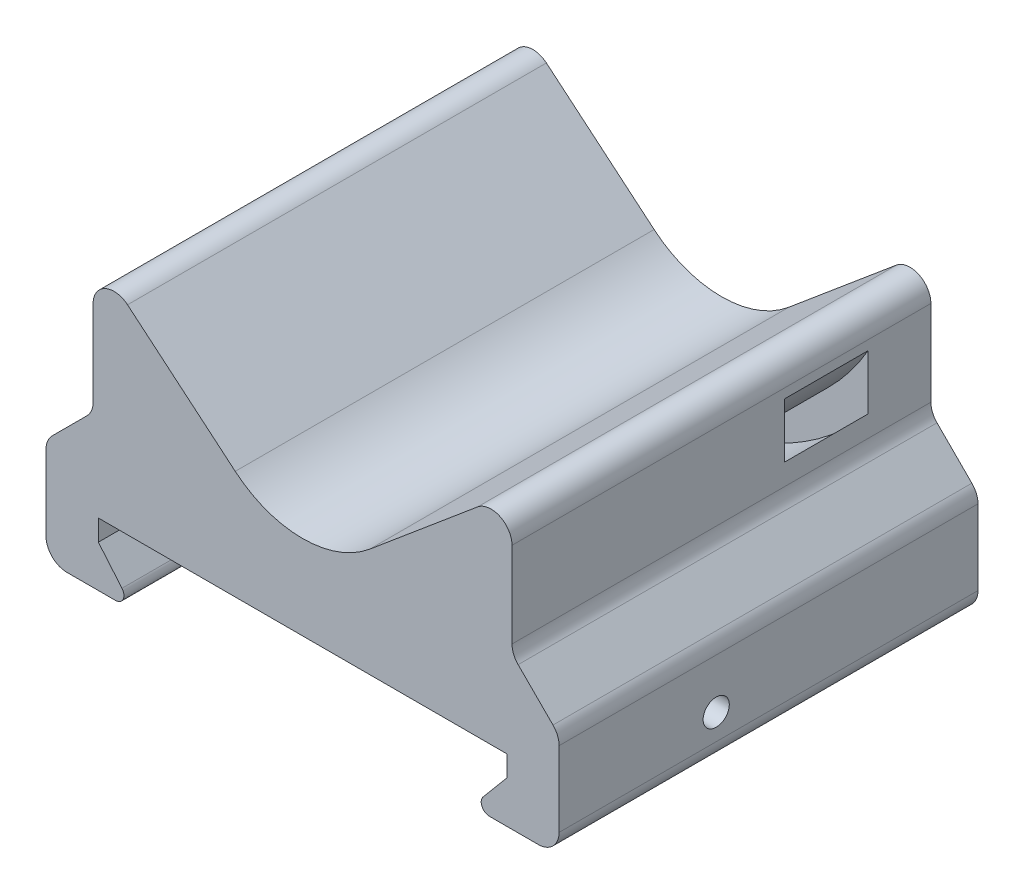
ISO-10303-21;
HEADER;
FILE_DESCRIPTION(('STEP AP214'),'2;1');
FILE_NAME('part.step','',(''),(''),'','','');
FILE_SCHEMA(('AUTOMOTIVE_DESIGN { 1 0 10303 214 1 1 1 1 }'));
ENDSEC;
DATA;
#1=APPLICATION_CONTEXT('core data for automotive mechanical design processes');
#2=APPLICATION_PROTOCOL_DEFINITION('international standard','automotive_design',2000,#1);
#3=PRODUCT_CONTEXT('',#1,'mechanical');
#4=PRODUCT('Part','Part','',(#3));
#5=PRODUCT_RELATED_PRODUCT_CATEGORY('part','',(#4));
#6=PRODUCT_DEFINITION_FORMATION('','',#4);
#7=PRODUCT_DEFINITION_CONTEXT('part definition',#1,'design');
#8=PRODUCT_DEFINITION('design','',#6,#7);
#9=PRODUCT_DEFINITION_SHAPE('','',#8);
#10=(LENGTH_UNIT() NAMED_UNIT(*) SI_UNIT(.MILLI.,.METRE.));
#11=(NAMED_UNIT(*) PLANE_ANGLE_UNIT() SI_UNIT($,.RADIAN.));
#12=(NAMED_UNIT(*) SI_UNIT($,.STERADIAN.) SOLID_ANGLE_UNIT());
#13=UNCERTAINTY_MEASURE_WITH_UNIT(LENGTH_MEASURE(1.E-05),#10,'distance_accuracy_value','');
#14=(GEOMETRIC_REPRESENTATION_CONTEXT(3) GLOBAL_UNCERTAINTY_ASSIGNED_CONTEXT((#13)) GLOBAL_UNIT_ASSIGNED_CONTEXT((#10,
#11,#12)) REPRESENTATION_CONTEXT('',''));
#15=CARTESIAN_POINT('',(0.,0.,0.));
#16=DIRECTION('',(0.,0.,1.));
#17=DIRECTION('',(1.,0.,0.));
#18=AXIS2_PLACEMENT_3D('',#15,#16,#17);
#19=CARTESIAN_POINT('',(19.5,-2.,40.));
#20=DIRECTION('',(1.,0.,0.));
#21=DIRECTION('',(0.,0.,-1.));
#22=AXIS2_PLACEMENT_3D('',#19,#20,#21);
#23=PLANE('',#22);
#24=DIRECTION('',(0.,0.,-1.));
#25=VECTOR('',#24,1.);
#26=CARTESIAN_POINT('',(19.5,-2.,40.));
#27=LINE('',#26,#25);
#28=CARTESIAN_POINT('',(19.5,-2.,23.8316867639954));
#29=VERTEX_POINT('',#28);
#30=CARTESIAN_POINT('',(19.5,-2.,0.));
#31=VERTEX_POINT('',#30);
#32=EDGE_CURVE('E330',#29,#31,#27,.T.);
#33=ORIENTED_EDGE('',*,*,#32,.F.);
#34=CARTESIAN_POINT('',(19.5,-1.55554057263177,25.));
#35=DIRECTION('',(1.,0.,0.));
#36=DIRECTION('',(0.,0.,-1.));
#37=AXIS2_PLACEMENT_3D('',#34,#35,#36);
#38=CIRCLE('',#37,1.24999999999999);
#39=CARTESIAN_POINT('',(19.5,-2.,26.1683132360046));
#40=VERTEX_POINT('',#39);
#41=EDGE_CURVE('E50',#29,#40,#38,.T.);
#42=ORIENTED_EDGE('',*,*,#41,.T.);
#43=CARTESIAN_POINT('',(19.5,-2.,40.));
#44=VERTEX_POINT('',#43);
#45=EDGE_CURVE('E331',#44,#40,#27,.T.);
#46=ORIENTED_EDGE('',*,*,#45,.F.);
#47=DIRECTION('',(0.,-1.,0.));
#48=VECTOR('',#47,1.);
#49=CARTESIAN_POINT('',(19.5,-2.,40.));
#50=LINE('',#49,#48);
#51=CARTESIAN_POINT('',(19.5,0.,40.));
#52=VERTEX_POINT('',#51);
#53=EDGE_CURVE('E377',#52,#44,#50,.T.);
#54=ORIENTED_EDGE('',*,*,#53,.F.);
#55=DIRECTION('',(0.,0.,-1.));
#56=VECTOR('',#55,1.);
#57=CARTESIAN_POINT('',(19.5,0.,40.));
#58=LINE('',#57,#56);
#59=CARTESIAN_POINT('',(19.5,0.,0.));
#60=VERTEX_POINT('',#59);
#61=EDGE_CURVE('E430',#52,#60,#58,.T.);
#62=ORIENTED_EDGE('',*,*,#61,.T.);
#63=DIRECTION('',(0.,-1.,0.));
#64=VECTOR('',#63,1.);
#65=CARTESIAN_POINT('',(19.5,-2.,0.));
#66=LINE('',#65,#64);
#67=EDGE_CURVE('E376',#60,#31,#66,.T.);
#68=ORIENTED_EDGE('',*,*,#67,.T.);
#69=EDGE_LOOP('',(#33,#42,#46,#54,#62,#68));
#70=FACE_BOUND('',#69,.T.);
#71=ADVANCED_FACE('F37',(#70),#23,.F.);
#72=CARTESIAN_POINT('',(17.2463714572033,-4.68576991225075,40.));
#73=DIRECTION('',(0.766044443118974,-0.642787609686544,0.));
#74=DIRECTION('',(0.642787609686544,0.766044443118974,0.));
#75=AXIS2_PLACEMENT_3D('',#72,#73,#74);
#76=PLANE('',#75);
#77=ORIENTED_EDGE('',*,*,#45,.T.);
#78=CARTESIAN_POINT('',(19.872945741578,-1.55554057263177,25.));
#79=DIRECTION('',(0.766044443118974,-0.642787609686544,0.));
#80=DIRECTION('',(-0.642787609686544,-0.766044443118974,0.));
#81=AXIS2_PLACEMENT_3D('',#78,#79,#80);
#82=ELLIPSE('',#81,1.63175911166534,1.24999999999999);
#83=EDGE_CURVE('E253',#40,#29,#82,.T.);
#84=ORIENTED_EDGE('',*,*,#83,.T.);
#85=ORIENTED_EDGE('',*,*,#32,.T.);
#86=DIRECTION('',(-0.642787609686544,-0.766044443118974,0.));
#87=VECTOR('',#86,1.);
#88=CARTESIAN_POINT('',(17.2463714572033,-4.68576991225075,0.));
#89=LINE('',#88,#87);
#90=CARTESIAN_POINT('',(17.2463714572033,-4.68576991225075,0.));
#91=VERTEX_POINT('',#90);
#92=EDGE_CURVE('E433',#31,#91,#89,.T.);
#93=ORIENTED_EDGE('',*,*,#92,.T.);
#94=DIRECTION('',(0.,0.,-1.));
#95=VECTOR('',#94,1.);
#96=CARTESIAN_POINT('',(17.2463714572033,-4.68576991225075,40.));
#97=LINE('',#96,#95);
#98=CARTESIAN_POINT('',(17.2463714572033,-4.68576991225075,40.));
#99=VERTEX_POINT('',#98);
#100=EDGE_CURVE('E327',#99,#91,#97,.T.);
#101=ORIENTED_EDGE('',*,*,#100,.F.);
#102=DIRECTION('',(-0.642787609686544,-0.766044443118974,0.));
#103=VECTOR('',#102,1.);
#104=CARTESIAN_POINT('',(17.2463714572033,-4.68576991225075,40.));
#105=LINE('',#104,#103);
#106=EDGE_CURVE('E380',#44,#99,#105,.T.);
#107=ORIENTED_EDGE('',*,*,#106,.F.);
#108=EDGE_LOOP('',(#77,#84,#85,#93,#101,#107));
#109=FACE_BOUND('',#108,.T.);
#110=ADVANCED_FACE('F500',(#109),#76,.F.);
#111=CARTESIAN_POINT('',(17.8592070116985,-5.2,40.));
#112=DIRECTION('',(0.,0.,-1.));
#113=DIRECTION('',(-1.,0.,0.));
#114=AXIS2_PLACEMENT_3D('',#111,#112,#113);
#115=CYLINDRICAL_SURFACE('',#114,0.800000000000001);
#116=CARTESIAN_POINT('',(17.8592070116985,-5.2,0.));
#117=DIRECTION('',(0.,0.,1.));
#118=DIRECTION('',(-1.,0.,0.));
#119=AXIS2_PLACEMENT_3D('',#116,#117,#118);
#120=CIRCLE('',#119,0.800000000000001);
#121=CARTESIAN_POINT('',(17.8592070116985,-6.,0.));
#122=VERTEX_POINT('',#121);
#123=EDGE_CURVE('E435',#91,#122,#120,.T.);
#124=ORIENTED_EDGE('',*,*,#123,.T.);
#125=DIRECTION('',(0.,0.,-1.));
#126=VECTOR('',#125,1.);
#127=CARTESIAN_POINT('',(17.8592070116985,-6.,40.));
#128=LINE('',#127,#126);
#129=CARTESIAN_POINT('',(17.8592070116985,-6.,40.));
#130=VERTEX_POINT('',#129);
#131=EDGE_CURVE('E324',#130,#122,#128,.T.);
#132=ORIENTED_EDGE('',*,*,#131,.F.);
#133=CARTESIAN_POINT('',(17.8592070116985,-5.2,40.));
#134=DIRECTION('',(0.,0.,1.));
#135=DIRECTION('',(-1.,0.,0.));
#136=AXIS2_PLACEMENT_3D('',#133,#134,#135);
#137=CIRCLE('',#136,0.800000000000001);
#138=EDGE_CURVE('E383',#99,#130,#137,.T.);
#139=ORIENTED_EDGE('',*,*,#138,.F.);
#140=ORIENTED_EDGE('',*,*,#100,.T.);
#141=EDGE_LOOP('',(#124,#132,#139,#140));
#142=FACE_BOUND('',#141,.T.);
#143=ADVANCED_FACE('F530',(#142),#115,.T.);
#144=CARTESIAN_POINT('',(22.5,-6.,40.));
#145=DIRECTION('',(0.,1.,0.));
#146=DIRECTION('',(-1.,0.,0.));
#147=AXIS2_PLACEMENT_3D('',#144,#145,#146);
#148=PLANE('',#147);
#149=DIRECTION('',(1.,0.,0.));
#150=VECTOR('',#149,1.);
#151=CARTESIAN_POINT('',(22.5,-6.,0.));
#152=LINE('',#151,#150);
#153=CARTESIAN_POINT('',(22.5,-6.,0.));
#154=VERTEX_POINT('',#153);
#155=EDGE_CURVE('E437',#122,#154,#152,.T.);
#156=ORIENTED_EDGE('',*,*,#155,.T.);
#157=DIRECTION('',(0.,0.,-1.));
#158=VECTOR('',#157,1.);
#159=CARTESIAN_POINT('',(22.5,-6.,40.));
#160=LINE('',#159,#158);
#161=CARTESIAN_POINT('',(22.5,-6.,40.));
#162=VERTEX_POINT('',#161);
#163=EDGE_CURVE('E321',#162,#154,#160,.T.);
#164=ORIENTED_EDGE('',*,*,#163,.F.);
#165=DIRECTION('',(1.,0.,0.));
#166=VECTOR('',#165,1.);
#167=CARTESIAN_POINT('',(22.5,-6.,40.));
#168=LINE('',#167,#166);
#169=EDGE_CURVE('E385',#130,#162,#168,.T.);
#170=ORIENTED_EDGE('',*,*,#169,.F.);
#171=ORIENTED_EDGE('',*,*,#131,.T.);
#172=EDGE_LOOP('',(#156,#164,#170,#171));
#173=FACE_BOUND('',#172,.T.);
#174=ADVANCED_FACE('F534',(#173),#148,.F.);
#175=CARTESIAN_POINT('',(22.5,-4.,40.));
#176=DIRECTION('',(0.,0.,-1.));
#177=DIRECTION('',(-1.,0.,0.));
#178=AXIS2_PLACEMENT_3D('',#175,#176,#177);
#179=CYLINDRICAL_SURFACE('',#178,2.);
#180=CARTESIAN_POINT('',(22.5,-4.,0.));
#181=DIRECTION('',(0.,0.,1.));
#182=DIRECTION('',(-1.,0.,0.));
#183=AXIS2_PLACEMENT_3D('',#180,#181,#182);
#184=CIRCLE('',#183,2.);
#185=CARTESIAN_POINT('',(24.5,-4.,0.));
#186=VERTEX_POINT('',#185);
#187=EDGE_CURVE('E439',#154,#186,#184,.T.);
#188=ORIENTED_EDGE('',*,*,#187,.T.);
#189=DIRECTION('',(0.,0.,-1.));
#190=VECTOR('',#189,1.);
#191=CARTESIAN_POINT('',(24.5,-4.,40.));
#192=LINE('',#191,#190);
#193=CARTESIAN_POINT('',(24.5,-4.,40.));
#194=VERTEX_POINT('',#193);
#195=EDGE_CURVE('E318',#194,#186,#192,.T.);
#196=ORIENTED_EDGE('',*,*,#195,.F.);
#197=CARTESIAN_POINT('',(22.5,-4.,40.));
#198=DIRECTION('',(0.,0.,1.));
#199=DIRECTION('',(-1.,0.,0.));
#200=AXIS2_PLACEMENT_3D('',#197,#198,#199);
#201=CIRCLE('',#200,2.);
#202=EDGE_CURVE('E387',#162,#194,#201,.T.);
#203=ORIENTED_EDGE('',*,*,#202,.F.);
#204=ORIENTED_EDGE('',*,*,#163,.T.);
#205=EDGE_LOOP('',(#188,#196,#203,#204));
#206=FACE_BOUND('',#205,.T.);
#207=ADVANCED_FACE('F540',(#206),#179,.T.);
#208=CARTESIAN_POINT('',(24.5,3.17157287525381,40.));
#209=DIRECTION('',(-1.,0.,0.));
#210=DIRECTION('',(0.,0.,1.));
#211=AXIS2_PLACEMENT_3D('',#208,#209,#210);
#212=PLANE('',#211);
#213=CARTESIAN_POINT('',(24.5,-1.55554057263177,25.));
#214=DIRECTION('',(-1.,0.,0.));
#215=DIRECTION('',(0.,0.,1.));
#216=AXIS2_PLACEMENT_3D('',#213,#214,#215);
#217=CIRCLE('',#216,1.24999999999999);
#218=CARTESIAN_POINT('',(24.5,-1.55554057263177,26.25));
#219=VERTEX_POINT('',#218);
#220=EDGE_CURVE('E254',#219,#219,#217,.T.);
#221=ORIENTED_EDGE('',*,*,#220,.T.);
#222=EDGE_LOOP('',(#221));
#223=FACE_BOUND('',#222,.T.);
#224=DIRECTION('',(0.,1.,0.));
#225=VECTOR('',#224,1.);
#226=CARTESIAN_POINT('',(24.5,3.17157287525381,0.));
#227=LINE('',#226,#225);
#228=CARTESIAN_POINT('',(24.5,3.17157287525381,0.));
#229=VERTEX_POINT('',#228);
#230=EDGE_CURVE('E441',#186,#229,#227,.T.);
#231=ORIENTED_EDGE('',*,*,#230,.T.);
#232=DIRECTION('',(0.,0.,-1.));
#233=VECTOR('',#232,1.);
#234=CARTESIAN_POINT('',(24.5,3.17157287525381,40.));
#235=LINE('',#234,#233);
#236=CARTESIAN_POINT('',(24.5,3.17157287525381,40.));
#237=VERTEX_POINT('',#236);
#238=EDGE_CURVE('E315',#237,#229,#235,.T.);
#239=ORIENTED_EDGE('',*,*,#238,.F.);
#240=DIRECTION('',(0.,1.,0.));
#241=VECTOR('',#240,1.);
#242=CARTESIAN_POINT('',(24.5,3.17157287525381,40.));
#243=LINE('',#242,#241);
#244=EDGE_CURVE('E389',#194,#237,#243,.T.);
#245=ORIENTED_EDGE('',*,*,#244,.F.);
#246=ORIENTED_EDGE('',*,*,#195,.T.);
#247=EDGE_LOOP('',(#231,#239,#245,#246));
#248=FACE_BOUND('',#247,.T.);
#249=ADVANCED_FACE('F544',(#223,#248),#212,.F.);
#250=CARTESIAN_POINT('',(22.5,3.1715728752538,40.));
#251=DIRECTION('',(0.,0.,-1.));
#252=DIRECTION('',(-1.,0.,0.));
#253=AXIS2_PLACEMENT_3D('',#250,#251,#252);
#254=CYLINDRICAL_SURFACE('',#253,2.);
#255=CARTESIAN_POINT('',(22.5,3.1715728752538,0.));
#256=DIRECTION('',(0.,0.,1.));
#257=DIRECTION('',(-1.,0.,0.));
#258=AXIS2_PLACEMENT_3D('',#255,#256,#257);
#259=CIRCLE('',#258,2.);
#260=CARTESIAN_POINT('',(23.9142135623731,4.5857864376269,0.));
#261=VERTEX_POINT('',#260);
#262=EDGE_CURVE('E443',#229,#261,#259,.T.);
#263=ORIENTED_EDGE('',*,*,#262,.T.);
#264=DIRECTION('',(0.,0.,-1.));
#265=VECTOR('',#264,1.);
#266=CARTESIAN_POINT('',(23.9142135623731,4.5857864376269,40.));
#267=LINE('',#266,#265);
#268=CARTESIAN_POINT('',(23.9142135623731,4.5857864376269,40.));
#269=VERTEX_POINT('',#268);
#270=EDGE_CURVE('E312',#269,#261,#267,.T.);
#271=ORIENTED_EDGE('',*,*,#270,.F.);
#272=CARTESIAN_POINT('',(22.5,3.1715728752538,40.));
#273=DIRECTION('',(0.,0.,1.));
#274=DIRECTION('',(-1.,0.,0.));
#275=AXIS2_PLACEMENT_3D('',#272,#273,#274);
#276=CIRCLE('',#275,2.);
#277=EDGE_CURVE('E391',#237,#269,#276,.T.);
#278=ORIENTED_EDGE('',*,*,#277,.F.);
#279=ORIENTED_EDGE('',*,*,#238,.T.);
#280=EDGE_LOOP('',(#263,#271,#278,#279));
#281=FACE_BOUND('',#280,.T.);
#282=ADVANCED_FACE('F548',(#281),#254,.T.);
#283=CARTESIAN_POINT('',(20.5857864376269,7.91421356237308,40.));
#284=DIRECTION('',(-0.707106781186546,-0.707106781186549,0.));
#285=DIRECTION('',(0.707106781186549,-0.707106781186546,0.));
#286=AXIS2_PLACEMENT_3D('',#283,#284,#285);
#287=PLANE('',#286);
#288=DIRECTION('',(-0.707106781186548,0.707106781186546,0.));
#289=VECTOR('',#288,1.);
#290=CARTESIAN_POINT('',(20.5857864376269,7.91421356237308,0.));
#291=LINE('',#290,#289);
#292=CARTESIAN_POINT('',(20.5857864376269,7.91421356237308,0.));
#293=VERTEX_POINT('',#292);
#294=EDGE_CURVE('E445',#261,#293,#291,.T.);
#295=ORIENTED_EDGE('',*,*,#294,.T.);
#296=DIRECTION('',(0.,0.,-1.));
#297=VECTOR('',#296,1.);
#298=CARTESIAN_POINT('',(20.5857864376269,7.91421356237308,40.));
#299=LINE('',#298,#297);
#300=CARTESIAN_POINT('',(20.5857864376269,7.91421356237308,40.));
#301=VERTEX_POINT('',#300);
#302=EDGE_CURVE('E309',#301,#293,#299,.T.);
#303=ORIENTED_EDGE('',*,*,#302,.F.);
#304=DIRECTION('',(-0.707106781186548,0.707106781186546,0.));
#305=VECTOR('',#304,1.);
#306=CARTESIAN_POINT('',(20.5857864376269,7.91421356237308,40.));
#307=LINE('',#306,#305);
#308=EDGE_CURVE('E393',#269,#301,#307,.T.);
#309=ORIENTED_EDGE('',*,*,#308,.F.);
#310=ORIENTED_EDGE('',*,*,#270,.T.);
#311=EDGE_LOOP('',(#295,#303,#309,#310));
#312=FACE_BOUND('',#311,.T.);
#313=ADVANCED_FACE('F552',(#312),#287,.F.);
#314=CARTESIAN_POINT('',(22.,9.32842712474617,40.));
#315=DIRECTION('',(0.,0.,-1.));
#316=DIRECTION('',(-1.,0.,0.));
#317=AXIS2_PLACEMENT_3D('',#314,#315,#316);
#318=CYLINDRICAL_SURFACE('',#317,2.);
#319=CARTESIAN_POINT('',(22.,9.32842712474617,0.));
#320=DIRECTION('',(0.,0.,-1.));
#321=DIRECTION('',(1.,0.,0.));
#322=AXIS2_PLACEMENT_3D('',#319,#320,#321);
#323=CIRCLE('',#322,2.);
#324=CARTESIAN_POINT('',(20.,9.32842712474617,0.));
#325=VERTEX_POINT('',#324);
#326=EDGE_CURVE('E447',#293,#325,#323,.T.);
#327=ORIENTED_EDGE('',*,*,#326,.T.);
#328=DIRECTION('',(0.,0.,-1.));
#329=VECTOR('',#328,1.);
#330=CARTESIAN_POINT('',(20.,9.32842712474617,40.));
#331=LINE('',#330,#329);
#332=CARTESIAN_POINT('',(20.,9.32842712474617,40.));
#333=VERTEX_POINT('',#332);
#334=EDGE_CURVE('E306',#333,#325,#331,.T.);
#335=ORIENTED_EDGE('',*,*,#334,.F.);
#336=CARTESIAN_POINT('',(22.,9.32842712474617,40.));
#337=DIRECTION('',(0.,0.,-1.));
#338=DIRECTION('',(1.,0.,0.));
#339=AXIS2_PLACEMENT_3D('',#336,#337,#338);
#340=CIRCLE('',#339,2.);
#341=EDGE_CURVE('E395',#301,#333,#340,.T.);
#342=ORIENTED_EDGE('',*,*,#341,.F.);
#343=ORIENTED_EDGE('',*,*,#302,.T.);
#344=EDGE_LOOP('',(#327,#335,#342,#343));
#345=FACE_BOUND('',#344,.T.);
#346=ADVANCED_FACE('F556',(#345),#318,.F.);
#347=CARTESIAN_POINT('',(20.,17.4929787825266,40.));
#348=DIRECTION('',(-1.,0.,0.));
#349=DIRECTION('',(0.,0.,1.));
#350=AXIS2_PLACEMENT_3D('',#347,#348,#349);
#351=PLANE('',#350);
#352=DIRECTION('',(0.,0.,1.));
#353=VECTOR('',#352,1.);
#354=CARTESIAN_POINT('',(20.,16.5871519042062,29.3538484245368));
#355=LINE('',#354,#353);
#356=CARTESIAN_POINT('',(20.,16.5871519042062,14.));
#357=VERTEX_POINT('',#356);
#358=CARTESIAN_POINT('',(20.,16.5871519042062,6.));
#359=VERTEX_POINT('',#358);
#360=EDGE_CURVE('E361',#357,#359,#355,.F.);
#361=ORIENTED_EDGE('',*,*,#360,.T.);
#362=DIRECTION('',(0.,-1.,0.));
#363=VECTOR('',#362,1.);
#364=CARTESIAN_POINT('',(20.,17.4929787825266,6.));
#365=LINE('',#364,#363);
#366=CARTESIAN_POINT('',(20.,11.3563271074217,6.));
#367=VERTEX_POINT('',#366);
#368=EDGE_CURVE('E374',#359,#367,#365,.T.);
#369=ORIENTED_EDGE('',*,*,#368,.T.);
#370=DIRECTION('',(0.,0.,1.));
#371=VECTOR('',#370,1.);
#372=CARTESIAN_POINT('',(20.,11.3563271074217,29.3538484245368));
#373=LINE('',#372,#371);
#374=CARTESIAN_POINT('',(20.,11.3563271074217,14.));
#375=VERTEX_POINT('',#374);
#376=EDGE_CURVE('E360',#367,#375,#373,.T.);
#377=ORIENTED_EDGE('',*,*,#376,.T.);
#378=DIRECTION('',(0.,1.,0.));
#379=VECTOR('',#378,1.);
#380=CARTESIAN_POINT('',(20.,17.4929787825266,14.));
#381=LINE('',#380,#379);
#382=EDGE_CURVE('E365',#375,#357,#381,.T.);
#383=ORIENTED_EDGE('',*,*,#382,.T.);
#384=EDGE_LOOP('',(#361,#369,#377,#383));
#385=FACE_BOUND('',#384,.T.);
#386=DIRECTION('',(0.,1.,0.));
#387=VECTOR('',#386,1.);
#388=CARTESIAN_POINT('',(20.,17.4929787825266,0.));
#389=LINE('',#388,#387);
#390=CARTESIAN_POINT('',(20.,17.4929787825266,0.));
#391=VERTEX_POINT('',#390);
#392=EDGE_CURVE('E449',#325,#391,#389,.T.);
#393=ORIENTED_EDGE('',*,*,#392,.T.);
#394=DIRECTION('',(0.,0.,-1.));
#395=VECTOR('',#394,1.);
#396=CARTESIAN_POINT('',(20.,17.4929787825266,40.));
#397=LINE('',#396,#395);
#398=CARTESIAN_POINT('',(20.,17.4929787825266,40.));
#399=VERTEX_POINT('',#398);
#400=EDGE_CURVE('E303',#399,#391,#397,.T.);
#401=ORIENTED_EDGE('',*,*,#400,.F.);
#402=DIRECTION('',(0.,1.,0.));
#403=VECTOR('',#402,1.);
#404=CARTESIAN_POINT('',(20.,17.4929787825266,40.));
#405=LINE('',#404,#403);
#406=EDGE_CURVE('E397',#333,#399,#405,.T.);
#407=ORIENTED_EDGE('',*,*,#406,.F.);
#408=ORIENTED_EDGE('',*,*,#334,.T.);
#409=EDGE_LOOP('',(#393,#401,#407,#408));
#410=FACE_BOUND('',#409,.T.);
#411=ADVANCED_FACE('F512',(#385,#410),#351,.F.);
#412=CARTESIAN_POINT('',(18.,17.4929787825266,40.));
#413=DIRECTION('',(0.,0.,-1.));
#414=DIRECTION('',(-1.,0.,0.));
#415=AXIS2_PLACEMENT_3D('',#412,#413,#414);
#416=CYLINDRICAL_SURFACE('',#415,2.);
#417=CARTESIAN_POINT('',(18.,17.4929787825266,0.));
#418=DIRECTION('',(0.,0.,1.));
#419=DIRECTION('',(-1.,0.,0.));
#420=AXIS2_PLACEMENT_3D('',#417,#418,#419);
#421=CIRCLE('',#420,2.);
#422=CARTESIAN_POINT('',(16.7144247806269,19.0250676687646,0.));
#423=VERTEX_POINT('',#422);
#424=EDGE_CURVE('E451',#391,#423,#421,.T.);
#425=ORIENTED_EDGE('',*,*,#424,.T.);
#426=DIRECTION('',(0.,0.,-1.));
#427=VECTOR('',#426,1.);
#428=CARTESIAN_POINT('',(16.7144247806269,19.0250676687646,40.));
#429=LINE('',#428,#427);
#430=CARTESIAN_POINT('',(16.7144247806269,19.0250676687646,40.));
#431=VERTEX_POINT('',#430);
#432=EDGE_CURVE('E300',#431,#423,#429,.T.);
#433=ORIENTED_EDGE('',*,*,#432,.F.);
#434=CARTESIAN_POINT('',(18.,17.4929787825266,40.));
#435=DIRECTION('',(0.,0.,1.));
#436=DIRECTION('',(-1.,0.,0.));
#437=AXIS2_PLACEMENT_3D('',#434,#435,#436);
#438=CIRCLE('',#437,2.);
#439=EDGE_CURVE('E399',#399,#431,#438,.T.);
#440=ORIENTED_EDGE('',*,*,#439,.F.);
#441=ORIENTED_EDGE('',*,*,#400,.T.);
#442=EDGE_LOOP('',(#425,#433,#440,#441));
#443=FACE_BOUND('',#442,.T.);
#444=ADVANCED_FACE('F563',(#443),#416,.T.);
#445=CARTESIAN_POINT('',(6.42787609686544,10.3936284621331,40.));
#446=DIRECTION('',(0.642787609686544,-0.766044443118974,0.));
#447=DIRECTION('',(0.766044443118974,0.642787609686544,0.));
#448=AXIS2_PLACEMENT_3D('',#445,#446,#447);
#449=PLANE('',#448);
#450=DIRECTION('',(-0.766044443118974,-0.642787609686544,0.));
#451=VECTOR('',#450,1.);
#452=CARTESIAN_POINT('',(6.42787609686544,10.3936284621331,0.));
#453=LINE('',#452,#451);
#454=CARTESIAN_POINT('',(6.42787609686544,10.3936284621331,0.));
#455=VERTEX_POINT('',#454);
#456=EDGE_CURVE('E453',#423,#455,#453,.T.);
#457=ORIENTED_EDGE('',*,*,#456,.T.);
#458=DIRECTION('',(0.,0.,-1.));
#459=VECTOR('',#458,1.);
#460=CARTESIAN_POINT('',(6.42787609686544,10.3936284621331,40.));
#461=LINE('',#460,#459);
#462=CARTESIAN_POINT('',(6.42787609686544,10.3936284621331,40.));
#463=VERTEX_POINT('',#462);
#464=EDGE_CURVE('E297',#463,#455,#461,.T.);
#465=ORIENTED_EDGE('',*,*,#464,.F.);
#466=DIRECTION('',(-0.766044443118974,-0.642787609686544,0.));
#467=VECTOR('',#466,1.);
#468=CARTESIAN_POINT('',(6.42787609686544,10.3936284621331,40.));
#469=LINE('',#468,#467);
#470=EDGE_CURVE('E401',#431,#463,#469,.T.);
#471=ORIENTED_EDGE('',*,*,#470,.F.);
#472=ORIENTED_EDGE('',*,*,#432,.T.);
#473=EDGE_LOOP('',(#457,#465,#471,#472));
#474=FACE_BOUND('',#473,.T.);
#475=ADVANCED_FACE('F566',(#474),#449,.F.);
#476=CARTESIAN_POINT('',(0.,18.0540728933228,40.));
#477=DIRECTION('',(0.,0.,-1.));
#478=DIRECTION('',(-1.,0.,0.));
#479=AXIS2_PLACEMENT_3D('',#476,#477,#478);
#480=CYLINDRICAL_SURFACE('',#479,10.);
#481=CARTESIAN_POINT('',(0.,18.0540728933228,0.));
#482=DIRECTION('',(0.,0.,-1.));
#483=DIRECTION('',(1.,0.,0.));
#484=AXIS2_PLACEMENT_3D('',#481,#482,#483);
#485=CIRCLE('',#484,10.);
#486=CARTESIAN_POINT('',(-6.42787609686544,10.3936284621331,0.));
#487=VERTEX_POINT('',#486);
#488=EDGE_CURVE('E455',#455,#487,#485,.T.);
#489=ORIENTED_EDGE('',*,*,#488,.T.);
#490=DIRECTION('',(0.,0.,-1.));
#491=VECTOR('',#490,1.);
#492=CARTESIAN_POINT('',(-6.42787609686544,10.3936284621331,40.));
#493=LINE('',#492,#491);
#494=CARTESIAN_POINT('',(-6.42787609686544,10.3936284621331,40.));
#495=VERTEX_POINT('',#494);
#496=EDGE_CURVE('E294',#495,#487,#493,.T.);
#497=ORIENTED_EDGE('',*,*,#496,.F.);
#498=CARTESIAN_POINT('',(0.,18.0540728933228,40.));
#499=DIRECTION('',(0.,0.,-1.));
#500=DIRECTION('',(1.,0.,0.));
#501=AXIS2_PLACEMENT_3D('',#498,#499,#500);
#502=CIRCLE('',#501,10.);
#503=EDGE_CURVE('E403',#463,#495,#502,.T.);
#504=ORIENTED_EDGE('',*,*,#503,.F.);
#505=ORIENTED_EDGE('',*,*,#464,.T.);
#506=EDGE_LOOP('',(#489,#497,#504,#505));
#507=FACE_BOUND('',#506,.T.);
#508=ADVANCED_FACE('F570',(#507),#480,.F.);
#509=CARTESIAN_POINT('',(-6.42787609686544,10.3936284621331,40.));
#510=DIRECTION('',(-0.642787609686544,-0.766044443118974,0.));
#511=DIRECTION('',(0.766044443118974,-0.642787609686544,0.));
#512=AXIS2_PLACEMENT_3D('',#509,#510,#511);
#513=PLANE('',#512);
#514=DIRECTION('',(-0.766044443118974,0.642787609686544,0.));
#515=VECTOR('',#514,1.);
#516=CARTESIAN_POINT('',(-6.42787609686544,10.3936284621331,0.));
#517=LINE('',#516,#515);
#518=CARTESIAN_POINT('',(-16.7144247806269,19.0250676687646,0.));
#519=VERTEX_POINT('',#518);
#520=EDGE_CURVE('E457',#487,#519,#517,.T.);
#521=ORIENTED_EDGE('',*,*,#520,.T.);
#522=DIRECTION('',(0.,0.,-1.));
#523=VECTOR('',#522,1.);
#524=CARTESIAN_POINT('',(-16.7144247806269,19.0250676687646,40.));
#525=LINE('',#524,#523);
#526=CARTESIAN_POINT('',(-16.7144247806269,19.0250676687646,40.));
#527=VERTEX_POINT('',#526);
#528=EDGE_CURVE('E291',#527,#519,#525,.T.);
#529=ORIENTED_EDGE('',*,*,#528,.F.);
#530=DIRECTION('',(-0.766044443118974,0.642787609686544,0.));
#531=VECTOR('',#530,1.);
#532=CARTESIAN_POINT('',(-6.42787609686544,10.3936284621331,40.));
#533=LINE('',#532,#531);
#534=EDGE_CURVE('E405',#495,#527,#533,.T.);
#535=ORIENTED_EDGE('',*,*,#534,.F.);
#536=ORIENTED_EDGE('',*,*,#496,.T.);
#537=EDGE_LOOP('',(#521,#529,#535,#536));
#538=FACE_BOUND('',#537,.T.);
#539=ADVANCED_FACE('F574',(#538),#513,.F.);
#540=CARTESIAN_POINT('',(-18.,17.4929787825266,40.));
#541=DIRECTION('',(0.,0.,-1.));
#542=DIRECTION('',(-1.,0.,0.));
#543=AXIS2_PLACEMENT_3D('',#540,#541,#542);
#544=CYLINDRICAL_SURFACE('',#543,2.);
#545=CARTESIAN_POINT('',(-18.,17.4929787825266,0.));
#546=DIRECTION('',(0.,0.,1.));
#547=DIRECTION('',(-1.,0.,0.));
#548=AXIS2_PLACEMENT_3D('',#545,#546,#547);
#549=CIRCLE('',#548,2.);
#550=CARTESIAN_POINT('',(-20.,17.4929787825266,0.));
#551=VERTEX_POINT('',#550);
#552=EDGE_CURVE('E459',#519,#551,#549,.T.);
#553=ORIENTED_EDGE('',*,*,#552,.T.);
#554=DIRECTION('',(0.,0.,-1.));
#555=VECTOR('',#554,1.);
#556=CARTESIAN_POINT('',(-20.,17.4929787825266,40.));
#557=LINE('',#556,#555);
#558=CARTESIAN_POINT('',(-20.,17.4929787825266,40.));
#559=VERTEX_POINT('',#558);
#560=EDGE_CURVE('E288',#559,#551,#557,.T.);
#561=ORIENTED_EDGE('',*,*,#560,.F.);
#562=CARTESIAN_POINT('',(-18.,17.4929787825266,40.));
#563=DIRECTION('',(0.,0.,1.));
#564=DIRECTION('',(-1.,0.,0.));
#565=AXIS2_PLACEMENT_3D('',#562,#563,#564);
#566=CIRCLE('',#565,2.);
#567=EDGE_CURVE('E407',#527,#559,#566,.T.);
#568=ORIENTED_EDGE('',*,*,#567,.F.);
#569=ORIENTED_EDGE('',*,*,#528,.T.);
#570=EDGE_LOOP('',(#553,#561,#568,#569));
#571=FACE_BOUND('',#570,.T.);
#572=ADVANCED_FACE('F578',(#571),#544,.T.);
#573=CARTESIAN_POINT('',(-20.,17.4929787825266,40.));
#574=DIRECTION('',(1.,0.,0.));
#575=DIRECTION('',(0.,0.,-1.));
#576=AXIS2_PLACEMENT_3D('',#573,#574,#575);
#577=PLANE('',#576);
#578=DIRECTION('',(0.,0.,1.));
#579=VECTOR('',#578,1.);
#580=CARTESIAN_POINT('',(-20.,11.3563271074217,29.3538484245368));
#581=LINE('',#580,#579);
#582=CARTESIAN_POINT('',(-20.,11.3563271074217,14.));
#583=VERTEX_POINT('',#582);
#584=CARTESIAN_POINT('',(-20.,11.3563271074217,6.));
#585=VERTEX_POINT('',#584);
#586=EDGE_CURVE('E340',#583,#585,#581,.F.);
#587=ORIENTED_EDGE('',*,*,#586,.T.);
#588=DIRECTION('',(0.,1.,0.));
#589=VECTOR('',#588,1.);
#590=CARTESIAN_POINT('',(-20.,17.4929787825266,6.));
#591=LINE('',#590,#589);
#592=CARTESIAN_POINT('',(-20.,16.5871519042062,6.));
#593=VERTEX_POINT('',#592);
#594=EDGE_CURVE('E44',#585,#593,#591,.T.);
#595=ORIENTED_EDGE('',*,*,#594,.T.);
#596=DIRECTION('',(0.,0.,1.));
#597=VECTOR('',#596,1.);
#598=CARTESIAN_POINT('',(-20.,16.5871519042062,29.3538484245368));
#599=LINE('',#598,#597);
#600=CARTESIAN_POINT('',(-20.,16.5871519042062,14.));
#601=VERTEX_POINT('',#600);
#602=EDGE_CURVE('E334',#593,#601,#599,.T.);
#603=ORIENTED_EDGE('',*,*,#602,.T.);
#604=DIRECTION('',(0.,-1.,0.));
#605=VECTOR('',#604,1.);
#606=CARTESIAN_POINT('',(-20.,17.4929787825266,14.));
#607=LINE('',#606,#605);
#608=EDGE_CURVE('E337',#601,#583,#607,.T.);
#609=ORIENTED_EDGE('',*,*,#608,.T.);
#610=EDGE_LOOP('',(#587,#595,#603,#609));
#611=FACE_BOUND('',#610,.T.);
#612=DIRECTION('',(0.,-1.,0.));
#613=VECTOR('',#612,1.);
#614=CARTESIAN_POINT('',(-20.,17.4929787825266,0.));
#615=LINE('',#614,#613);
#616=CARTESIAN_POINT('',(-20.,9.32842712474617,0.));
#617=VERTEX_POINT('',#616);
#618=EDGE_CURVE('E461',#551,#617,#615,.T.);
#619=ORIENTED_EDGE('',*,*,#618,.T.);
#620=DIRECTION('',(0.,0.,-1.));
#621=VECTOR('',#620,1.);
#622=CARTESIAN_POINT('',(-20.,9.32842712474617,40.));
#623=LINE('',#622,#621);
#624=CARTESIAN_POINT('',(-20.,9.32842712474617,40.));
#625=VERTEX_POINT('',#624);
#626=EDGE_CURVE('E285',#625,#617,#623,.T.);
#627=ORIENTED_EDGE('',*,*,#626,.F.);
#628=DIRECTION('',(0.,-1.,0.));
#629=VECTOR('',#628,1.);
#630=CARTESIAN_POINT('',(-20.,17.4929787825266,40.));
#631=LINE('',#630,#629);
#632=EDGE_CURVE('E409',#559,#625,#631,.T.);
#633=ORIENTED_EDGE('',*,*,#632,.F.);
#634=ORIENTED_EDGE('',*,*,#560,.T.);
#635=EDGE_LOOP('',(#619,#627,#633,#634));
#636=FACE_BOUND('',#635,.T.);
#637=ADVANCED_FACE('F344',(#611,#636),#577,.F.);
#638=CARTESIAN_POINT('',(-22.,9.32842712474617,40.));
#639=DIRECTION('',(0.,0.,-1.));
#640=DIRECTION('',(-1.,0.,0.));
#641=AXIS2_PLACEMENT_3D('',#638,#639,#640);
#642=CYLINDRICAL_SURFACE('',#641,2.);
#643=CARTESIAN_POINT('',(-22.,9.32842712474617,0.));
#644=DIRECTION('',(0.,0.,-1.));
#645=DIRECTION('',(1.,0.,0.));
#646=AXIS2_PLACEMENT_3D('',#643,#644,#645);
#647=CIRCLE('',#646,2.);
#648=CARTESIAN_POINT('',(-20.5857864376269,7.91421356237307,0.));
#649=VERTEX_POINT('',#648);
#650=EDGE_CURVE('E463',#617,#649,#647,.T.);
#651=ORIENTED_EDGE('',*,*,#650,.T.);
#652=DIRECTION('',(0.,0.,-1.));
#653=VECTOR('',#652,1.);
#654=CARTESIAN_POINT('',(-20.5857864376269,7.91421356237307,40.));
#655=LINE('',#654,#653);
#656=CARTESIAN_POINT('',(-20.5857864376269,7.91421356237307,40.));
#657=VERTEX_POINT('',#656);
#658=EDGE_CURVE('E282',#657,#649,#655,.T.);
#659=ORIENTED_EDGE('',*,*,#658,.F.);
#660=CARTESIAN_POINT('',(-22.,9.32842712474617,40.));
#661=DIRECTION('',(0.,0.,-1.));
#662=DIRECTION('',(1.,0.,0.));
#663=AXIS2_PLACEMENT_3D('',#660,#661,#662);
#664=CIRCLE('',#663,2.);
#665=EDGE_CURVE('E411',#625,#657,#664,.T.);
#666=ORIENTED_EDGE('',*,*,#665,.F.);
#667=ORIENTED_EDGE('',*,*,#626,.T.);
#668=EDGE_LOOP('',(#651,#659,#666,#667));
#669=FACE_BOUND('',#668,.T.);
#670=ADVANCED_FACE('F585',(#669),#642,.F.);
#671=CARTESIAN_POINT('',(-20.5857864376269,7.91421356237307,40.));
#672=DIRECTION('',(0.707106781186546,-0.707106781186549,0.));
#673=DIRECTION('',(0.707106781186549,0.707106781186546,0.));
#674=AXIS2_PLACEMENT_3D('',#671,#672,#673);
#675=PLANE('',#674);
#676=DIRECTION('',(-0.707106781186549,-0.707106781186546,0.));
#677=VECTOR('',#676,1.);
#678=CARTESIAN_POINT('',(-20.5857864376269,7.91421356237307,0.));
#679=LINE('',#678,#677);
#680=CARTESIAN_POINT('',(-23.9142135623731,4.5857864376269,0.));
#681=VERTEX_POINT('',#680);
#682=EDGE_CURVE('E465',#649,#681,#679,.T.);
#683=ORIENTED_EDGE('',*,*,#682,.T.);
#684=DIRECTION('',(0.,0.,-1.));
#685=VECTOR('',#684,1.);
#686=CARTESIAN_POINT('',(-23.9142135623731,4.5857864376269,40.));
#687=LINE('',#686,#685);
#688=CARTESIAN_POINT('',(-23.9142135623731,4.5857864376269,40.));
#689=VERTEX_POINT('',#688);
#690=EDGE_CURVE('E279',#689,#681,#687,.T.);
#691=ORIENTED_EDGE('',*,*,#690,.F.);
#692=DIRECTION('',(-0.707106781186549,-0.707106781186546,0.));
#693=VECTOR('',#692,1.);
#694=CARTESIAN_POINT('',(-20.5857864376269,7.91421356237307,40.));
#695=LINE('',#694,#693);
#696=EDGE_CURVE('E413',#657,#689,#695,.T.);
#697=ORIENTED_EDGE('',*,*,#696,.F.);
#698=ORIENTED_EDGE('',*,*,#658,.T.);
#699=EDGE_LOOP('',(#683,#691,#697,#698));
#700=FACE_BOUND('',#699,.T.);
#701=ADVANCED_FACE('F588',(#700),#675,.F.);
#702=CARTESIAN_POINT('',(-22.5,3.1715728752538,40.));
#703=DIRECTION('',(0.,0.,-1.));
#704=DIRECTION('',(-1.,0.,0.));
#705=AXIS2_PLACEMENT_3D('',#702,#703,#704);
#706=CYLINDRICAL_SURFACE('',#705,2.);
#707=CARTESIAN_POINT('',(-22.5,3.1715728752538,0.));
#708=DIRECTION('',(0.,0.,1.));
#709=DIRECTION('',(-1.,0.,0.));
#710=AXIS2_PLACEMENT_3D('',#707,#708,#709);
#711=CIRCLE('',#710,2.);
#712=CARTESIAN_POINT('',(-24.5,3.1715728752538,0.));
#713=VERTEX_POINT('',#712);
#714=EDGE_CURVE('E467',#681,#713,#711,.T.);
#715=ORIENTED_EDGE('',*,*,#714,.T.);
#716=DIRECTION('',(0.,0.,-1.));
#717=VECTOR('',#716,1.);
#718=CARTESIAN_POINT('',(-24.5,3.1715728752538,40.));
#719=LINE('',#718,#717);
#720=CARTESIAN_POINT('',(-24.5,3.1715728752538,40.));
#721=VERTEX_POINT('',#720);
#722=EDGE_CURVE('E276',#721,#713,#719,.T.);
#723=ORIENTED_EDGE('',*,*,#722,.F.);
#724=CARTESIAN_POINT('',(-22.5,3.1715728752538,40.));
#725=DIRECTION('',(0.,0.,1.));
#726=DIRECTION('',(-1.,0.,0.));
#727=AXIS2_PLACEMENT_3D('',#724,#725,#726);
#728=CIRCLE('',#727,2.);
#729=EDGE_CURVE('E415',#689,#721,#728,.T.);
#730=ORIENTED_EDGE('',*,*,#729,.F.);
#731=ORIENTED_EDGE('',*,*,#690,.T.);
#732=EDGE_LOOP('',(#715,#723,#730,#731));
#733=FACE_BOUND('',#732,.T.);
#734=ADVANCED_FACE('F592',(#733),#706,.T.);
#735=CARTESIAN_POINT('',(-24.5,3.1715728752538,40.));
#736=DIRECTION('',(1.,0.,0.));
#737=DIRECTION('',(0.,1.,0.));
#738=AXIS2_PLACEMENT_3D('',#735,#736,#737);
#739=PLANE('',#738);
#740=CARTESIAN_POINT('',(-24.5,-1.55554057263177,25.));
#741=DIRECTION('',(-1.,0.,0.));
#742=DIRECTION('',(0.,0.,1.));
#743=AXIS2_PLACEMENT_3D('',#740,#741,#742);
#744=CIRCLE('',#743,1.525);
#745=CARTESIAN_POINT('',(-24.5,-1.55554057263177,26.525));
#746=VERTEX_POINT('',#745);
#747=EDGE_CURVE('E713',#746,#746,#744,.T.);
#748=ORIENTED_EDGE('',*,*,#747,.F.);
#749=EDGE_LOOP('',(#748));
#750=FACE_BOUND('',#749,.T.);
#751=DIRECTION('',(0.,-1.,0.));
#752=VECTOR('',#751,1.);
#753=CARTESIAN_POINT('',(-24.5,3.1715728752538,0.));
#754=LINE('',#753,#752);
#755=CARTESIAN_POINT('',(-24.5,-4.00000000000001,0.));
#756=VERTEX_POINT('',#755);
#757=EDGE_CURVE('E469',#713,#756,#754,.T.);
#758=ORIENTED_EDGE('',*,*,#757,.T.);
#759=DIRECTION('',(0.,0.,-1.));
#760=VECTOR('',#759,1.);
#761=CARTESIAN_POINT('',(-24.5,-4.00000000000001,40.));
#762=LINE('',#761,#760);
#763=CARTESIAN_POINT('',(-24.5,-4.00000000000001,40.));
#764=VERTEX_POINT('',#763);
#765=EDGE_CURVE('E273',#764,#756,#762,.T.);
#766=ORIENTED_EDGE('',*,*,#765,.F.);
#767=DIRECTION('',(0.,-1.,0.));
#768=VECTOR('',#767,1.);
#769=CARTESIAN_POINT('',(-24.5,3.1715728752538,40.));
#770=LINE('',#769,#768);
#771=EDGE_CURVE('E417',#721,#764,#770,.T.);
#772=ORIENTED_EDGE('',*,*,#771,.F.);
#773=ORIENTED_EDGE('',*,*,#722,.T.);
#774=EDGE_LOOP('',(#758,#766,#772,#773));
#775=FACE_BOUND('',#774,.T.);
#776=ADVANCED_FACE('F596',(#750,#775),#739,.F.);
#777=CARTESIAN_POINT('',(-22.5,-4.00000000000001,40.));
#778=DIRECTION('',(0.,0.,-1.));
#779=DIRECTION('',(-1.,0.,0.));
#780=AXIS2_PLACEMENT_3D('',#777,#778,#779);
#781=CYLINDRICAL_SURFACE('',#780,2.);
#782=CARTESIAN_POINT('',(-22.5,-4.00000000000001,0.));
#783=DIRECTION('',(0.,0.,1.));
#784=DIRECTION('',(-1.,0.,0.));
#785=AXIS2_PLACEMENT_3D('',#782,#783,#784);
#786=CIRCLE('',#785,2.);
#787=CARTESIAN_POINT('',(-22.5,-6.00000000000001,0.));
#788=VERTEX_POINT('',#787);
#789=EDGE_CURVE('E471',#756,#788,#786,.T.);
#790=ORIENTED_EDGE('',*,*,#789,.T.);
#791=DIRECTION('',(0.,0.,-1.));
#792=VECTOR('',#791,1.);
#793=CARTESIAN_POINT('',(-22.5,-6.00000000000001,40.));
#794=LINE('',#793,#792);
#795=CARTESIAN_POINT('',(-22.5,-6.00000000000001,40.));
#796=VERTEX_POINT('',#795);
#797=EDGE_CURVE('E270',#796,#788,#794,.T.);
#798=ORIENTED_EDGE('',*,*,#797,.F.);
#799=CARTESIAN_POINT('',(-22.5,-4.00000000000001,40.));
#800=DIRECTION('',(0.,0.,1.));
#801=DIRECTION('',(-1.,0.,0.));
#802=AXIS2_PLACEMENT_3D('',#799,#800,#801);
#803=CIRCLE('',#802,2.);
#804=EDGE_CURVE('E419',#764,#796,#803,.T.);
#805=ORIENTED_EDGE('',*,*,#804,.F.);
#806=ORIENTED_EDGE('',*,*,#765,.T.);
#807=EDGE_LOOP('',(#790,#798,#805,#806));
#808=FACE_BOUND('',#807,.T.);
#809=ADVANCED_FACE('F600',(#808),#781,.T.);
#810=CARTESIAN_POINT('',(-22.5,-6.00000000000001,40.));
#811=DIRECTION('',(0.,1.,0.));
#812=DIRECTION('',(-1.,0.,0.));
#813=AXIS2_PLACEMENT_3D('',#810,#811,#812);
#814=PLANE('',#813);
#815=DIRECTION('',(1.,0.,0.));
#816=VECTOR('',#815,1.);
#817=CARTESIAN_POINT('',(-22.5,-6.00000000000001,0.));
#818=LINE('',#817,#816);
#819=CARTESIAN_POINT('',(-17.8592070116985,-6.,0.));
#820=VERTEX_POINT('',#819);
#821=EDGE_CURVE('E473',#788,#820,#818,.T.);
#822=ORIENTED_EDGE('',*,*,#821,.T.);
#823=DIRECTION('',(0.,0.,-1.));
#824=VECTOR('',#823,1.);
#825=CARTESIAN_POINT('',(-17.8592070116985,-6.,40.));
#826=LINE('',#825,#824);
#827=CARTESIAN_POINT('',(-17.8592070116985,-6.,40.));
#828=VERTEX_POINT('',#827);
#829=EDGE_CURVE('E262',#828,#820,#826,.T.);
#830=ORIENTED_EDGE('',*,*,#829,.F.);
#831=DIRECTION('',(1.,0.,0.));
#832=VECTOR('',#831,1.);
#833=CARTESIAN_POINT('',(-22.5,-6.00000000000001,40.));
#834=LINE('',#833,#832);
#835=EDGE_CURVE('E421',#796,#828,#834,.T.);
#836=ORIENTED_EDGE('',*,*,#835,.F.);
#837=ORIENTED_EDGE('',*,*,#797,.T.);
#838=EDGE_LOOP('',(#822,#830,#836,#837));
#839=FACE_BOUND('',#838,.T.);
#840=ADVANCED_FACE('F604',(#839),#814,.F.);
#841=CARTESIAN_POINT('',(-17.8592070116985,-5.2,40.));
#842=DIRECTION('',(0.,0.,-1.));
#843=DIRECTION('',(-1.,0.,0.));
#844=AXIS2_PLACEMENT_3D('',#841,#842,#843);
#845=CYLINDRICAL_SURFACE('',#844,0.8);
#846=CARTESIAN_POINT('',(-17.8592070116985,-5.2,0.));
#847=DIRECTION('',(0.,0.,1.));
#848=DIRECTION('',(-1.,0.,0.));
#849=AXIS2_PLACEMENT_3D('',#846,#847,#848);
#850=CIRCLE('',#849,0.8);
#851=CARTESIAN_POINT('',(-17.2463714572033,-4.68576991225076,0.));
#852=VERTEX_POINT('',#851);
#853=EDGE_CURVE('E475',#820,#852,#850,.T.);
#854=ORIENTED_EDGE('',*,*,#853,.T.);
#855=DIRECTION('',(0.,0.,-1.));
#856=VECTOR('',#855,1.);
#857=CARTESIAN_POINT('',(-17.2463714572033,-4.68576991225076,40.));
#858=LINE('',#857,#856);
#859=CARTESIAN_POINT('',(-17.2463714572033,-4.68576991225076,40.));
#860=VERTEX_POINT('',#859);
#861=EDGE_CURVE('E259',#860,#852,#858,.T.);
#862=ORIENTED_EDGE('',*,*,#861,.F.);
#863=CARTESIAN_POINT('',(-17.8592070116985,-5.2,40.));
#864=DIRECTION('',(0.,0.,1.));
#865=DIRECTION('',(-1.,0.,0.));
#866=AXIS2_PLACEMENT_3D('',#863,#864,#865);
#867=CIRCLE('',#866,0.8);
#868=EDGE_CURVE('E423',#828,#860,#867,.T.);
#869=ORIENTED_EDGE('',*,*,#868,.F.);
#870=ORIENTED_EDGE('',*,*,#829,.T.);
#871=EDGE_LOOP('',(#854,#862,#869,#870));
#872=FACE_BOUND('',#871,.T.);
#873=ADVANCED_FACE('F608',(#872),#845,.T.);
#874=CARTESIAN_POINT('',(-17.2463714572033,-4.68576991225076,40.));
#875=DIRECTION('',(-0.766044443118974,-0.642787609686544,0.));
#876=DIRECTION('',(0.642787609686544,-0.766044443118974,0.));
#877=AXIS2_PLACEMENT_3D('',#874,#875,#876);
#878=PLANE('',#877);
#879=DIRECTION('',(0.,0.,-1.));
#880=VECTOR('',#879,1.);
#881=CARTESIAN_POINT('',(-19.5,-2.,40.));
#882=LINE('',#881,#880);
#883=CARTESIAN_POINT('',(-19.5,-2.,23.8316867639954));
#884=VERTEX_POINT('',#883);
#885=CARTESIAN_POINT('',(-19.5,-2.,0.));
#886=VERTEX_POINT('',#885);
#887=EDGE_CURVE('E252',#884,#886,#882,.T.);
#888=ORIENTED_EDGE('',*,*,#887,.F.);
#889=CARTESIAN_POINT('',(-19.872945741578,-1.55554057263177,25.));
#890=DIRECTION('',(-0.766044443118974,-0.642787609686544,0.));
#891=DIRECTION('',(-0.642787609686544,0.766044443118974,0.));
#892=AXIS2_PLACEMENT_3D('',#889,#890,#891);
#893=ELLIPSE('',#892,1.63175911166534,1.24999999999999);
#894=CARTESIAN_POINT('',(-19.5,-2.,26.1683132360046));
#895=VERTEX_POINT('',#894);
#896=EDGE_CURVE('E57',#884,#895,#893,.T.);
#897=ORIENTED_EDGE('',*,*,#896,.T.);
#898=CARTESIAN_POINT('',(-19.5,-2.,40.));
#899=VERTEX_POINT('',#898);
#900=EDGE_CURVE('E249',#899,#895,#882,.T.);
#901=ORIENTED_EDGE('',*,*,#900,.F.);
#902=DIRECTION('',(-0.642787609686544,0.766044443118974,0.));
#903=VECTOR('',#902,1.);
#904=CARTESIAN_POINT('',(-17.2463714572033,-4.68576991225076,40.));
#905=LINE('',#904,#903);
#906=EDGE_CURVE('E425',#860,#899,#905,.T.);
#907=ORIENTED_EDGE('',*,*,#906,.F.);
#908=ORIENTED_EDGE('',*,*,#861,.T.);
#909=DIRECTION('',(-0.642787609686544,0.766044443118974,0.));
#910=VECTOR('',#909,1.);
#911=CARTESIAN_POINT('',(-17.2463714572033,-4.68576991225076,0.));
#912=LINE('',#911,#910);
#913=EDGE_CURVE('E477',#852,#886,#912,.T.);
#914=ORIENTED_EDGE('',*,*,#913,.T.);
#915=EDGE_LOOP('',(#888,#897,#901,#907,#908,#914));
#916=FACE_BOUND('',#915,.T.);
#917=ADVANCED_FACE('F247',(#916),#878,.F.);
#918=CARTESIAN_POINT('',(-19.5,-2.,40.));
#919=DIRECTION('',(-1.,0.,0.));
#920=DIRECTION('',(0.,-1.,0.));
#921=AXIS2_PLACEMENT_3D('',#918,#919,#920);
#922=PLANE('',#921);
#923=ORIENTED_EDGE('',*,*,#900,.T.);
#924=CARTESIAN_POINT('',(-19.5,-1.55554057263177,25.));
#925=DIRECTION('',(-1.,0.,0.));
#926=DIRECTION('',(0.,-1.,0.));
#927=AXIS2_PLACEMENT_3D('',#924,#925,#926);
#928=CIRCLE('',#927,1.24999999999999);
#929=EDGE_CURVE('E11',#895,#884,#928,.T.);
#930=ORIENTED_EDGE('',*,*,#929,.T.);
#931=ORIENTED_EDGE('',*,*,#887,.T.);
#932=DIRECTION('',(0.,1.,0.));
#933=VECTOR('',#932,1.);
#934=CARTESIAN_POINT('',(-19.5,-2.,0.));
#935=LINE('',#934,#933);
#936=CARTESIAN_POINT('',(-19.5,0.,0.));
#937=VERTEX_POINT('',#936);
#938=EDGE_CURVE('E479',#886,#937,#935,.T.);
#939=ORIENTED_EDGE('',*,*,#938,.T.);
#940=DIRECTION('',(0.,0.,-1.));
#941=VECTOR('',#940,1.);
#942=CARTESIAN_POINT('',(-19.5,0.,40.));
#943=LINE('',#942,#941);
#944=CARTESIAN_POINT('',(-19.5,0.,40.));
#945=VERTEX_POINT('',#944);
#946=EDGE_CURVE('E264',#945,#937,#943,.T.);
#947=ORIENTED_EDGE('',*,*,#946,.F.);
#948=DIRECTION('',(0.,1.,0.));
#949=VECTOR('',#948,1.);
#950=CARTESIAN_POINT('',(-19.5,-2.,40.));
#951=LINE('',#950,#949);
#952=EDGE_CURVE('E258',#899,#945,#951,.T.);
#953=ORIENTED_EDGE('',*,*,#952,.F.);
#954=EDGE_LOOP('',(#923,#930,#931,#939,#947,#953));
#955=FACE_BOUND('',#954,.T.);
#956=ADVANCED_FACE('F256',(#955),#922,.F.);
#957=CARTESIAN_POINT('',(19.5,0.,40.));
#958=DIRECTION('',(0.,1.,0.));
#959=DIRECTION('',(-1.,0.,0.));
#960=AXIS2_PLACEMENT_3D('',#957,#958,#959);
#961=PLANE('',#960);
#962=DIRECTION('',(1.,0.,0.));
#963=VECTOR('',#962,1.);
#964=CARTESIAN_POINT('',(19.5,0.,0.));
#965=LINE('',#964,#963);
#966=EDGE_CURVE('E381',#937,#60,#965,.T.);
#967=ORIENTED_EDGE('',*,*,#966,.T.);
#968=ORIENTED_EDGE('',*,*,#61,.F.);
#969=DIRECTION('',(1.,0.,0.));
#970=VECTOR('',#969,1.);
#971=CARTESIAN_POINT('',(19.5,0.,40.));
#972=LINE('',#971,#970);
#973=EDGE_CURVE('E428',#945,#52,#972,.T.);
#974=ORIENTED_EDGE('',*,*,#973,.F.);
#975=ORIENTED_EDGE('',*,*,#946,.T.);
#976=EDGE_LOOP('',(#967,#968,#974,#975));
#977=FACE_BOUND('',#976,.T.);
#978=ADVANCED_FACE('F490',(#977),#961,.F.);
#979=CARTESIAN_POINT('',(-17.8592070116985,-5.2,40.));
#980=DIRECTION('',(0.,0.,-1.));
#981=DIRECTION('',(-1.,0.,0.));
#982=AXIS2_PLACEMENT_3D('',#979,#980,#981);
#983=PLANE('',#982);
#984=ORIENTED_EDGE('',*,*,#53,.T.);
#985=ORIENTED_EDGE('',*,*,#106,.T.);
#986=ORIENTED_EDGE('',*,*,#138,.T.);
#987=ORIENTED_EDGE('',*,*,#169,.T.);
#988=ORIENTED_EDGE('',*,*,#202,.T.);
#989=ORIENTED_EDGE('',*,*,#244,.T.);
#990=ORIENTED_EDGE('',*,*,#277,.T.);
#991=ORIENTED_EDGE('',*,*,#308,.T.);
#992=ORIENTED_EDGE('',*,*,#341,.T.);
#993=ORIENTED_EDGE('',*,*,#406,.T.);
#994=ORIENTED_EDGE('',*,*,#439,.T.);
#995=ORIENTED_EDGE('',*,*,#470,.T.);
#996=ORIENTED_EDGE('',*,*,#503,.T.);
#997=ORIENTED_EDGE('',*,*,#534,.T.);
#998=ORIENTED_EDGE('',*,*,#567,.T.);
#999=ORIENTED_EDGE('',*,*,#632,.T.);
#1000=ORIENTED_EDGE('',*,*,#665,.T.);
#1001=ORIENTED_EDGE('',*,*,#696,.T.);
#1002=ORIENTED_EDGE('',*,*,#729,.T.);
#1003=ORIENTED_EDGE('',*,*,#771,.T.);
#1004=ORIENTED_EDGE('',*,*,#804,.T.);
#1005=ORIENTED_EDGE('',*,*,#835,.T.);
#1006=ORIENTED_EDGE('',*,*,#868,.T.);
#1007=ORIENTED_EDGE('',*,*,#906,.T.);
#1008=ORIENTED_EDGE('',*,*,#952,.T.);
#1009=ORIENTED_EDGE('',*,*,#973,.T.);
#1010=EDGE_LOOP('',(#984,#985,#986,#987,#988,#989,#990,#991,#992,#993,#994,#995,#996,#997,#998,
#999,#1000,#1001,#1002,#1003,#1004,#1005,#1006,#1007,#1008,#1009));
#1011=FACE_BOUND('',#1010,.T.);
#1012=ADVANCED_FACE('F619',(#1011),#983,.F.);
#1013=CARTESIAN_POINT('',(-17.8592070116985,-5.2,0.));
#1014=DIRECTION('',(0.,0.,-1.));
#1015=DIRECTION('',(-1.,0.,0.));
#1016=AXIS2_PLACEMENT_3D('',#1013,#1014,#1015);
#1017=PLANE('',#1016);
#1018=ORIENTED_EDGE('',*,*,#67,.F.);
#1019=ORIENTED_EDGE('',*,*,#966,.F.);
#1020=ORIENTED_EDGE('',*,*,#938,.F.);
#1021=ORIENTED_EDGE('',*,*,#913,.F.);
#1022=ORIENTED_EDGE('',*,*,#853,.F.);
#1023=ORIENTED_EDGE('',*,*,#821,.F.);
#1024=ORIENTED_EDGE('',*,*,#789,.F.);
#1025=ORIENTED_EDGE('',*,*,#757,.F.);
#1026=ORIENTED_EDGE('',*,*,#714,.F.);
#1027=ORIENTED_EDGE('',*,*,#682,.F.);
#1028=ORIENTED_EDGE('',*,*,#650,.F.);
#1029=ORIENTED_EDGE('',*,*,#618,.F.);
#1030=ORIENTED_EDGE('',*,*,#552,.F.);
#1031=ORIENTED_EDGE('',*,*,#520,.F.);
#1032=ORIENTED_EDGE('',*,*,#488,.F.);
#1033=ORIENTED_EDGE('',*,*,#456,.F.);
#1034=ORIENTED_EDGE('',*,*,#424,.F.);
#1035=ORIENTED_EDGE('',*,*,#392,.F.);
#1036=ORIENTED_EDGE('',*,*,#326,.F.);
#1037=ORIENTED_EDGE('',*,*,#294,.F.);
#1038=ORIENTED_EDGE('',*,*,#262,.F.);
#1039=ORIENTED_EDGE('',*,*,#230,.F.);
#1040=ORIENTED_EDGE('',*,*,#187,.F.);
#1041=ORIENTED_EDGE('',*,*,#155,.F.);
#1042=ORIENTED_EDGE('',*,*,#123,.F.);
#1043=ORIENTED_EDGE('',*,*,#92,.F.);
#1044=EDGE_LOOP('',(#1018,#1019,#1020,#1021,#1022,#1023,#1024,#1025,#1026,#1027,#1028,#1029,
#1030,#1031,#1032,#1033,#1034,#1035,#1036,#1037,#1038,#1039,#1040,#1041,#1042,#1043));
#1045=FACE_BOUND('',#1044,.T.);
#1046=ADVANCED_FACE('F493',(#1045),#1017,.T.);
#1047=CARTESIAN_POINT('',(0.,5.,6.));
#1048=DIRECTION('',(0.,0.,-1.));
#1049=DIRECTION('',(-1.,0.,0.));
#1050=AXIS2_PLACEMENT_3D('',#1047,#1048,#1049);
#1051=PLANE('',#1050);
#1052=CARTESIAN_POINT('',(0.,28.0540728933228,6.));
#1053=DIRECTION('',(0.,0.,1.));
#1054=DIRECTION('',(1.,0.,0.));
#1055=AXIS2_PLACEMENT_3D('',#1052,#1053,#1054);
#1056=CIRCLE('',#1055,23.0540728933228);
#1057=EDGE_CURVE('E354',#593,#359,#1056,.T.);
#1058=ORIENTED_EDGE('',*,*,#1057,.F.);
#1059=ORIENTED_EDGE('',*,*,#594,.F.);
#1060=CARTESIAN_POINT('',(0.,28.0540728933228,6.));
#1061=DIRECTION('',(0.,0.,1.));
#1062=DIRECTION('',(1.,0.,0.));
#1063=AXIS2_PLACEMENT_3D('',#1060,#1061,#1062);
#1064=CIRCLE('',#1063,26.0540728933228);
#1065=EDGE_CURVE('E352',#585,#367,#1064,.T.);
#1066=ORIENTED_EDGE('',*,*,#1065,.T.);
#1067=ORIENTED_EDGE('',*,*,#368,.F.);
#1068=EDGE_LOOP('',(#1058,#1059,#1066,#1067));
#1069=FACE_BOUND('',#1068,.T.);
#1070=ADVANCED_FACE('F350',(#1069),#1051,.F.);
#1071=CARTESIAN_POINT('',(0.,28.0540728933228,29.3538484245368));
#1072=DIRECTION('',(0.,0.,1.));
#1073=DIRECTION('',(1.,0.,0.));
#1074=AXIS2_PLACEMENT_3D('',#1071,#1072,#1073);
#1075=CYLINDRICAL_SURFACE('',#1074,26.0540728933228);
#1076=ORIENTED_EDGE('',*,*,#1065,.F.);
#1077=ORIENTED_EDGE('',*,*,#586,.F.);
#1078=CARTESIAN_POINT('',(0.,28.0540728933228,14.));
#1079=DIRECTION('',(0.,0.,1.));
#1080=DIRECTION('',(1.,0.,0.));
#1081=AXIS2_PLACEMENT_3D('',#1078,#1079,#1080);
#1082=CIRCLE('',#1081,26.0540728933228);
#1083=EDGE_CURVE('E362',#583,#375,#1082,.T.);
#1084=ORIENTED_EDGE('',*,*,#1083,.T.);
#1085=ORIENTED_EDGE('',*,*,#376,.F.);
#1086=EDGE_LOOP('',(#1076,#1077,#1084,#1085));
#1087=FACE_BOUND('',#1086,.T.);
#1088=ADVANCED_FACE('F356',(#1087),#1075,.F.);
#1089=CARTESIAN_POINT('',(0.,5.,14.));
#1090=DIRECTION('',(0.,0.,1.));
#1091=DIRECTION('',(1.,0.,0.));
#1092=AXIS2_PLACEMENT_3D('',#1089,#1090,#1091);
#1093=PLANE('',#1092);
#1094=ORIENTED_EDGE('',*,*,#1083,.F.);
#1095=ORIENTED_EDGE('',*,*,#608,.F.);
#1096=CARTESIAN_POINT('',(0.,28.0540728933228,14.));
#1097=DIRECTION('',(0.,0.,1.));
#1098=DIRECTION('',(1.,0.,0.));
#1099=AXIS2_PLACEMENT_3D('',#1096,#1097,#1098);
#1100=CIRCLE('',#1099,23.0540728933228);
#1101=EDGE_CURVE('E367',#601,#357,#1100,.T.);
#1102=ORIENTED_EDGE('',*,*,#1101,.T.);
#1103=ORIENTED_EDGE('',*,*,#382,.F.);
#1104=EDGE_LOOP('',(#1094,#1095,#1102,#1103));
#1105=FACE_BOUND('',#1104,.T.);
#1106=ADVANCED_FACE('F509',(#1105),#1093,.F.);
#1107=CARTESIAN_POINT('',(0.,28.0540728933228,29.3538484245368));
#1108=DIRECTION('',(0.,0.,1.));
#1109=DIRECTION('',(1.,0.,0.));
#1110=AXIS2_PLACEMENT_3D('',#1107,#1108,#1109);
#1111=CYLINDRICAL_SURFACE('',#1110,23.0540728933228);
#1112=ORIENTED_EDGE('',*,*,#1101,.F.);
#1113=ORIENTED_EDGE('',*,*,#602,.F.);
#1114=ORIENTED_EDGE('',*,*,#1057,.T.);
#1115=ORIENTED_EDGE('',*,*,#360,.F.);
#1116=EDGE_LOOP('',(#1112,#1113,#1114,#1115));
#1117=FACE_BOUND('',#1116,.T.);
#1118=ADVANCED_FACE('F514',(#1117),#1111,.T.);
#1119=CARTESIAN_POINT('',(-24.5,-1.55554057263177,25.));
#1120=DIRECTION('',(-1.,0.,0.));
#1121=DIRECTION('',(0.,0.,1.));
#1122=AXIS2_PLACEMENT_3D('',#1119,#1120,#1121);
#1123=CYLINDRICAL_SURFACE('',#1122,1.24999999999999);
#1124=CARTESIAN_POINT('',(-24.225,-1.55554057263177,25.));
#1125=DIRECTION('',(-1.,0.,0.));
#1126=DIRECTION('',(0.,0.,1.));
#1127=AXIS2_PLACEMENT_3D('',#1124,#1125,#1126);
#1128=CIRCLE('',#1127,1.24999999999999);
#1129=CARTESIAN_POINT('',(-24.225,-1.55554057263177,26.25));
#1130=VERTEX_POINT('',#1129);
#1131=EDGE_CURVE('E711',#1130,#1130,#1128,.T.);
#1132=ORIENTED_EDGE('',*,*,#1131,.T.);
#1133=EDGE_LOOP('',(#1132));
#1134=FACE_BOUND('',#1133,.T.);
#1135=ORIENTED_EDGE('',*,*,#929,.F.);
#1136=ORIENTED_EDGE('',*,*,#896,.F.);
#1137=EDGE_LOOP('',(#1135,#1136));
#1138=FACE_BOUND('',#1137,.T.);
#1139=ADVANCED_FACE('F241',(#1134,#1138),#1123,.F.);
#1140=CARTESIAN_POINT('',(-24.5,-1.55554057263177,25.));
#1141=DIRECTION('',(-1.,0.,0.));
#1142=DIRECTION('',(0.,0.,1.));
#1143=AXIS2_PLACEMENT_3D('',#1140,#1141,#1142);
#1144=CONICAL_SURFACE('',#1143,1.525,0.785398163397436);
#1145=ORIENTED_EDGE('',*,*,#1131,.F.);
#1146=EDGE_LOOP('',(#1145));
#1147=FACE_BOUND('',#1146,.T.);
#1148=ORIENTED_EDGE('',*,*,#747,.T.);
#1149=EDGE_LOOP('',(#1148));
#1150=FACE_BOUND('',#1149,.T.);
#1151=ADVANCED_FACE('F521',(#1147,#1150),#1144,.F.);
#1152=ORIENTED_EDGE('',*,*,#220,.F.);
#1153=EDGE_LOOP('',(#1152));
#1154=FACE_BOUND('',#1153,.T.);
#1155=ORIENTED_EDGE('',*,*,#83,.F.);
#1156=ORIENTED_EDGE('',*,*,#41,.F.);
#1157=EDGE_LOOP('',(#1155,#1156));
#1158=FACE_BOUND('',#1157,.T.);
#1159=ADVANCED_FACE('F524',(#1154,#1158),#1123,.F.);
#1160=CLOSED_SHELL('',(#71,#110,#143,#174,#207,#249,#282,#313,#346,#411,#444,#475,#508,#539,
#572,#637,#670,#701,#734,#776,#809,#840,#873,#917,#956,#978,#1012,#1046,#1070,#1088,#1106,#1118,
#1139,#1151,#1159));
#1161=MANIFOLD_SOLID_BREP('B2',#1160);
#1162=ADVANCED_BREP_SHAPE_REPRESENTATION('',(#18,#1161),#14);
#1163=SHAPE_DEFINITION_REPRESENTATION(#9,#1162);
ENDSEC;
END-ISO-10303-21;
